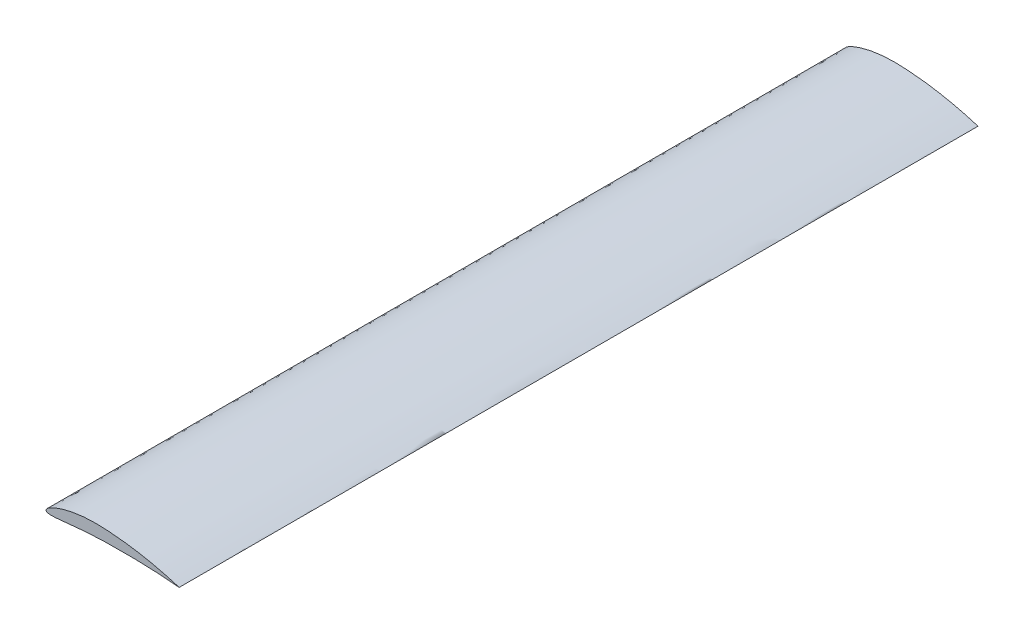
ISO-10303-21;
HEADER;
FILE_DESCRIPTION(('STEP AP214'),'2;1');
FILE_NAME('part.step','',(''),(''),'','','');
FILE_SCHEMA(('AUTOMOTIVE_DESIGN { 1 0 10303 214 1 1 1 1 }'));
ENDSEC;
DATA;
#1=APPLICATION_CONTEXT('core data for automotive mechanical design processes');
#2=APPLICATION_PROTOCOL_DEFINITION('international standard','automotive_design',2000,#1);
#3=PRODUCT_CONTEXT('',#1,'mechanical');
#4=PRODUCT('Part','Part','',(#3));
#5=PRODUCT_RELATED_PRODUCT_CATEGORY('part','',(#4));
#6=PRODUCT_DEFINITION_FORMATION('','',#4);
#7=PRODUCT_DEFINITION_CONTEXT('part definition',#1,'design');
#8=PRODUCT_DEFINITION('design','',#6,#7);
#9=PRODUCT_DEFINITION_SHAPE('','',#8);
#10=(LENGTH_UNIT() NAMED_UNIT(*) SI_UNIT(.MILLI.,.METRE.));
#11=(NAMED_UNIT(*) PLANE_ANGLE_UNIT() SI_UNIT($,.RADIAN.));
#12=(NAMED_UNIT(*) SI_UNIT($,.STERADIAN.) SOLID_ANGLE_UNIT());
#13=UNCERTAINTY_MEASURE_WITH_UNIT(LENGTH_MEASURE(1.E-05),#10,'distance_accuracy_value','');
#14=(GEOMETRIC_REPRESENTATION_CONTEXT(3) GLOBAL_UNCERTAINTY_ASSIGNED_CONTEXT((#13)) GLOBAL_UNIT_ASSIGNED_CONTEXT((#10,
#11,#12)) REPRESENTATION_CONTEXT('',''));
#15=CARTESIAN_POINT('',(0.,0.,0.));
#16=DIRECTION('',(0.,0.,1.));
#17=DIRECTION('',(1.,0.,0.));
#18=AXIS2_PLACEMENT_3D('',#15,#16,#17);
#19=CARTESIAN_POINT('',(304.8,0.,1371.6));
#20=CARTESIAN_POINT('',(304.805073835061,0.0223452680578498,1371.6));
#21=CARTESIAN_POINT('',(303.481699081625,0.379318260828661,1371.6));
#22=CARTESIAN_POINT('',(302.145524330643,0.848466215095664,1371.6));
#23=CARTESIAN_POINT('',(298.844611234037,1.82353660719256,1371.6));
#24=CARTESIAN_POINT('',(294.771260672626,3.04463063019122,1371.6));
#25=CARTESIAN_POINT('',(289.403610922227,4.57967871530911,1371.6));
#26=CARTESIAN_POINT('',(283.019296887063,6.33075892914484,1371.6));
#27=CARTESIAN_POINT('',(275.600696272141,8.26043412946769,1371.6));
#28=CARTESIAN_POINT('',(267.246213076995,10.2929637206997,1371.6));
#29=CARTESIAN_POINT('',(258.039148324702,12.3760065147052,1371.6));
#30=CARTESIAN_POINT('',(248.071437392036,14.4370903830013,1371.6));
#31=CARTESIAN_POINT('',(237.45168025058,16.4188948561654,1371.6));
#32=CARTESIAN_POINT('',(226.29155793466,18.2607483252873,1371.6));
#33=CARTESIAN_POINT('',(214.711374976223,19.9087064187818,1371.6));
#34=CARTESIAN_POINT('',(202.838786210941,21.3175430292081,1371.6));
#35=CARTESIAN_POINT('',(190.806137406406,22.447996452999,1371.6));
#36=CARTESIAN_POINT('',(178.744937721421,23.2536532538869,1371.6));
#37=CARTESIAN_POINT('',(166.728787829646,23.7666812850697,1371.6));
#38=CARTESIAN_POINT('',(154.88525678694,23.7721299883427,1371.6));
#39=CARTESIAN_POINT('',(143.373669303429,23.1646715123743,1371.6));
#40=CARTESIAN_POINT('',(132.403352581969,22.0281827193296,1371.6));
#41=CARTESIAN_POINT('',(122.115548216266,20.4174876809883,1371.6));
#42=CARTESIAN_POINT('',(112.640063500293,18.4155341329611,1371.6));
#43=CARTESIAN_POINT('',(104.089600042979,16.1258261042971,1371.6));
#44=CARTESIAN_POINT('',(96.5664559961237,13.6478084155019,1371.6));
#45=CARTESIAN_POINT('',(90.1476962254819,11.1033503594104,1371.6));
#46=CARTESIAN_POINT('',(84.9047787965066,8.57702912419902,1371.6));
#47=CARTESIAN_POINT('',(80.8540309618645,6.19737021686916,1371.6));
#48=CARTESIAN_POINT('',(78.0465533665293,3.98266451747633,1371.6));
#49=CARTESIAN_POINT('',(76.3296194192058,2.03855857428529,1371.6));
#50=CARTESIAN_POINT('',(75.9249809803407,-0.0800442824522794,1371.6));
#51=CARTESIAN_POINT('',(77.4139039831405,-1.63139365007727,1371.6));
#52=CARTESIAN_POINT('',(79.8773468535195,-2.33384084806238,1371.6));
#53=CARTESIAN_POINT('',(83.355375502213,-2.74428338329707,1371.6));
#54=CARTESIAN_POINT('',(87.9167437676675,-2.76351008534628,1371.6));
#55=CARTESIAN_POINT('',(93.5157873982498,-2.48212130368435,1371.6));
#56=CARTESIAN_POINT('',(100.096306859504,-1.92054378272974,1371.6));
#57=CARTESIAN_POINT('',(107.582782406244,-1.15214222125715,1371.6));
#58=CARTESIAN_POINT('',(115.898989590437,-0.243411782167234,1371.6));
#59=CARTESIAN_POINT('',(124.956384486197,0.737053209643648,1371.6));
#60=CARTESIAN_POINT('',(134.673091917614,1.70813372458074,1371.6));
#61=CARTESIAN_POINT('',(144.955523614402,2.58495096040492,1371.6));
#62=CARTESIAN_POINT('',(155.715305743031,3.30909362914475,1371.6));
#63=CARTESIAN_POINT('',(166.91650921692,3.78883218259216,1371.6));
#64=CARTESIAN_POINT('',(178.454355982485,4.05772292537427,1371.6));
#65=CARTESIAN_POINT('',(190.205787255072,4.29699762821281,1371.6));
#66=CARTESIAN_POINT('',(201.986839641927,4.41851665123374,1371.6));
#67=CARTESIAN_POINT('',(213.665061962112,4.430864608468,1371.6));
#68=CARTESIAN_POINT('',(225.1147703885,4.31962562476159,1371.6));
#69=CARTESIAN_POINT('',(236.210849268118,4.09303246129216,1371.6));
#70=CARTESIAN_POINT('',(246.831288505364,3.7600368654831,1371.6));
#71=CARTESIAN_POINT('',(256.857808237716,3.3439098711033,1371.6));
#72=CARTESIAN_POINT('',(266.176761031174,2.86467190676008,1371.6));
#73=CARTESIAN_POINT('',(274.677370215537,2.35548326445463,1371.6));
#74=CARTESIAN_POINT('',(282.269488448442,1.83875501304582,1371.6));
#75=CARTESIAN_POINT('',(288.833821998197,1.35250350683508,1371.6));
#76=CARTESIAN_POINT('',(294.376832898367,0.905545818584938,1371.6));
#77=CARTESIAN_POINT('',(298.602495472749,0.556825304945098,1371.6));
#78=CARTESIAN_POINT('',(302.023292656171,0.232680411945481,1371.6));
#79=CARTESIAN_POINT('',(303.438256175386,0.154943914454373,1371.6));
#80=CARTESIAN_POINT('',(304.794957490684,-0.0222073088674643,1371.6));
#81=CARTESIAN_POINT('',(304.8,0.,1371.6));
#82=B_SPLINE_CURVE_WITH_KNOTS('',3,(#19,#20,#21,#22,#23,#24,#25,#26,#27,#28,#29,#30,#31,#32,#33,
#34,#35,#36,#37,#38,#39,#40,#41,#42,#43,#44,#45,#46,#47,#48,#49,#50,#51,#52,#53,#54,#55,#56,#57,
#58,#59,#60,#61,#62,#63,#64,#65,#66,#67,#68,#69,#70,#71,#72,#73,#74,#75,#76,#77,#78,#79,#80,
#81),.UNSPECIFIED.,.T.,.F.,(4,1,1,1,1,1,1,1,1,1,1,1,1,1,1,1,1,1,1,1,1,1,1,1,1,1,1,1,1,1,1,1,1,1,
1,1,1,1,1,1,1,1,1,1,1,1,1,1,1,1,1,1,1,1,1,1,1,1,1,1,4),(0.,0.00137455348322331,
0.00548449728179396,0.0122733609908927,0.021682195504866,0.0335806119079948,0.0478307427867091,
0.0643059527211734,0.082777332043007,0.103063756455997,0.124929016786915,0.148149110667858,
0.172444694611559,0.197572105868171,0.223268880537162,0.249227774933554,0.275186209349679,
0.300900708934774,0.326462938278696,0.351222485186767,0.374905858971967,0.397269706218861,
0.418072413969665,0.437079533175026,0.454093093767394,0.468919631578705,0.48139171235289,
0.491447126518173,0.499023571234557,0.504293734329401,0.507921918342,0.511539686153778,
0.516780527527172,0.524216490268905,0.533991629403711,0.546033957270731,0.560220284382465,
0.576403357410148,0.594370816485922,0.613951103581465,0.634916884969972,0.657088503485648,
0.680229909573905,0.704175481107386,0.72909036740664,0.754353775526935,0.779667752347888,
0.804760119952374,0.829359338708984,0.853208710008459,0.876041363199166,0.897604065496152,
0.917662212410958,0.935969860405553,0.952309787739252,0.966502759006892,0.978350082728452,
0.987731492337842,0.994510920242662,0.998633932979557,1.),.UNSPECIFIED.);
#83=DIRECTION('',(0.,0.,-1.));
#84=VECTOR('',#83,1.);
#85=SURFACE_OF_LINEAR_EXTRUSION('',#82,#84);
#86=CARTESIAN_POINT('',(304.8,0.,1371.6));
#87=VERTEX_POINT('',#86);
#88=EDGE_CURVE('E10',#87,#87,#82,.T.);
#89=ORIENTED_EDGE('',*,*,#88,.F.);
#90=EDGE_LOOP('',(#89));
#91=FACE_BOUND('',#90,.T.);
#92=CARTESIAN_POINT('',(304.8,0.,0.));
#93=CARTESIAN_POINT('',(304.805073835061,0.0223452680578498,0.));
#94=CARTESIAN_POINT('',(303.481699081625,0.379318260828661,0.));
#95=CARTESIAN_POINT('',(302.145524330643,0.848466215095664,0.));
#96=CARTESIAN_POINT('',(298.844611234037,1.82353660719256,0.));
#97=CARTESIAN_POINT('',(294.771260672626,3.04463063019122,0.));
#98=CARTESIAN_POINT('',(289.403610922227,4.57967871530911,0.));
#99=CARTESIAN_POINT('',(283.019296887063,6.33075892914484,0.));
#100=CARTESIAN_POINT('',(275.600696272141,8.26043412946769,0.));
#101=CARTESIAN_POINT('',(267.246213076995,10.2929637206997,0.));
#102=CARTESIAN_POINT('',(258.039148324702,12.3760065147052,0.));
#103=CARTESIAN_POINT('',(248.071437392036,14.4370903830013,0.));
#104=CARTESIAN_POINT('',(237.45168025058,16.4188948561654,0.));
#105=CARTESIAN_POINT('',(226.29155793466,18.2607483252873,0.));
#106=CARTESIAN_POINT('',(214.711374976223,19.9087064187818,0.));
#107=CARTESIAN_POINT('',(202.838786210941,21.3175430292081,0.));
#108=CARTESIAN_POINT('',(190.806137406406,22.447996452999,0.));
#109=CARTESIAN_POINT('',(178.744937721421,23.2536532538869,0.));
#110=CARTESIAN_POINT('',(166.728787829646,23.7666812850697,0.));
#111=CARTESIAN_POINT('',(154.88525678694,23.7721299883427,0.));
#112=CARTESIAN_POINT('',(143.373669303429,23.1646715123743,0.));
#113=CARTESIAN_POINT('',(132.403352581969,22.0281827193296,0.));
#114=CARTESIAN_POINT('',(122.115548216266,20.4174876809883,0.));
#115=CARTESIAN_POINT('',(112.640063500293,18.4155341329611,0.));
#116=CARTESIAN_POINT('',(104.089600042979,16.1258261042971,0.));
#117=CARTESIAN_POINT('',(96.5664559961237,13.6478084155019,0.));
#118=CARTESIAN_POINT('',(90.1476962254819,11.1033503594104,0.));
#119=CARTESIAN_POINT('',(84.9047787965066,8.57702912419902,0.));
#120=CARTESIAN_POINT('',(80.8540309618645,6.19737021686916,0.));
#121=CARTESIAN_POINT('',(78.0465533665293,3.98266451747633,0.));
#122=CARTESIAN_POINT('',(76.3296194192058,2.03855857428529,0.));
#123=CARTESIAN_POINT('',(75.9249809803407,-0.0800442824522794,0.));
#124=CARTESIAN_POINT('',(77.4139039831405,-1.63139365007727,0.));
#125=CARTESIAN_POINT('',(79.8773468535195,-2.33384084806238,0.));
#126=CARTESIAN_POINT('',(83.355375502213,-2.74428338329707,0.));
#127=CARTESIAN_POINT('',(87.9167437676675,-2.76351008534628,0.));
#128=CARTESIAN_POINT('',(93.5157873982498,-2.48212130368435,0.));
#129=CARTESIAN_POINT('',(100.096306859504,-1.92054378272974,0.));
#130=CARTESIAN_POINT('',(107.582782406244,-1.15214222125715,0.));
#131=CARTESIAN_POINT('',(115.898989590437,-0.243411782167234,0.));
#132=CARTESIAN_POINT('',(124.956384486197,0.737053209643648,0.));
#133=CARTESIAN_POINT('',(134.673091917614,1.70813372458074,0.));
#134=CARTESIAN_POINT('',(144.955523614402,2.58495096040492,0.));
#135=CARTESIAN_POINT('',(155.715305743031,3.30909362914475,0.));
#136=CARTESIAN_POINT('',(166.91650921692,3.78883218259216,0.));
#137=CARTESIAN_POINT('',(178.454355982485,4.05772292537427,0.));
#138=CARTESIAN_POINT('',(190.205787255072,4.29699762821281,0.));
#139=CARTESIAN_POINT('',(201.986839641927,4.41851665123374,0.));
#140=CARTESIAN_POINT('',(213.665061962112,4.430864608468,0.));
#141=CARTESIAN_POINT('',(225.1147703885,4.31962562476159,0.));
#142=CARTESIAN_POINT('',(236.210849268118,4.09303246129216,0.));
#143=CARTESIAN_POINT('',(246.831288505364,3.7600368654831,0.));
#144=CARTESIAN_POINT('',(256.857808237716,3.3439098711033,0.));
#145=CARTESIAN_POINT('',(266.176761031174,2.86467190676008,0.));
#146=CARTESIAN_POINT('',(274.677370215537,2.35548326445463,0.));
#147=CARTESIAN_POINT('',(282.269488448442,1.83875501304582,0.));
#148=CARTESIAN_POINT('',(288.833821998197,1.35250350683508,0.));
#149=CARTESIAN_POINT('',(294.376832898367,0.905545818584938,0.));
#150=CARTESIAN_POINT('',(298.602495472749,0.556825304945098,0.));
#151=CARTESIAN_POINT('',(302.023292656171,0.232680411945481,0.));
#152=CARTESIAN_POINT('',(303.438256175386,0.154943914454373,0.));
#153=CARTESIAN_POINT('',(304.794957490684,-0.0222073088674643,0.));
#154=CARTESIAN_POINT('',(304.8,0.,0.));
#155=B_SPLINE_CURVE_WITH_KNOTS('',3,(#92,#93,#94,#95,#96,#97,#98,#99,#100,#101,#102,#103,#104,
#105,#106,#107,#108,#109,#110,#111,#112,#113,#114,#115,#116,#117,#118,#119,#120,#121,#122,#123,
#124,#125,#126,#127,#128,#129,#130,#131,#132,#133,#134,#135,#136,#137,#138,#139,#140,#141,#142,
#143,#144,#145,#146,#147,#148,#149,#150,#151,#152,#153,#154),.UNSPECIFIED.,.T.,.F.,(4,1,1,1,1,1,
1,1,1,1,1,1,1,1,1,1,1,1,1,1,1,1,1,1,1,1,1,1,1,1,1,1,1,1,1,1,1,1,1,1,1,1,1,1,1,1,1,1,1,1,1,1,1,1,
1,1,1,1,1,1,4),(0.,0.00137455348322331,0.00548449728179396,0.0122733609908927,0.021682195504866,
0.0335806119079948,0.0478307427867091,0.0643059527211734,0.082777332043007,0.103063756455997,
0.124929016786915,0.148149110667858,0.172444694611559,0.197572105868171,0.223268880537162,
0.249227774933554,0.275186209349679,0.300900708934774,0.326462938278696,0.351222485186767,
0.374905858971967,0.397269706218861,0.418072413969665,0.437079533175026,0.454093093767394,
0.468919631578705,0.48139171235289,0.491447126518173,0.499023571234557,0.504293734329401,
0.507921918342,0.511539686153778,0.516780527527172,0.524216490268905,0.533991629403711,
0.546033957270731,0.560220284382465,0.576403357410148,0.594370816485922,0.613951103581465,
0.634916884969972,0.657088503485648,0.680229909573905,0.704175481107386,0.72909036740664,
0.754353775526935,0.779667752347888,0.804760119952374,0.829359338708984,0.853208710008459,
0.876041363199166,0.897604065496152,0.917662212410958,0.935969860405553,0.952309787739252,
0.966502759006892,0.978350082728452,0.987731492337842,0.994510920242662,0.998633932979557,1.),.UNSPECIFIED.);
#156=CARTESIAN_POINT('',(304.8,0.,0.));
#157=VERTEX_POINT('',#156);
#158=EDGE_CURVE('E34',#157,#157,#155,.T.);
#159=ORIENTED_EDGE('',*,*,#158,.T.);
#160=EDGE_LOOP('',(#159));
#161=FACE_BOUND('',#160,.T.);
#162=ADVANCED_FACE('F30',(#91,#161),#85,.F.);
#163=CARTESIAN_POINT('',(77.5238305450115,3.33891842036834,1371.6));
#164=DIRECTION('',(0.,0.,-1.));
#165=DIRECTION('',(-1.,0.,0.));
#166=AXIS2_PLACEMENT_3D('',#163,#164,#165);
#167=PLANE('',#166);
#168=ORIENTED_EDGE('',*,*,#88,.T.);
#169=EDGE_LOOP('',(#168));
#170=FACE_BOUND('',#169,.T.);
#171=ADVANCED_FACE('F53',(#170),#167,.F.);
#172=CARTESIAN_POINT('',(77.5238305450115,3.33891842036834,0.));
#173=DIRECTION('',(0.,0.,-1.));
#174=DIRECTION('',(-1.,0.,0.));
#175=AXIS2_PLACEMENT_3D('',#172,#173,#174);
#176=PLANE('',#175);
#177=ORIENTED_EDGE('',*,*,#158,.F.);
#178=EDGE_LOOP('',(#177));
#179=FACE_BOUND('',#178,.T.);
#180=ADVANCED_FACE('F51',(#179),#176,.T.);
#181=CLOSED_SHELL('',(#162,#171,#180));
#182=MANIFOLD_SOLID_BREP('B2',#181);
#183=ADVANCED_BREP_SHAPE_REPRESENTATION('',(#18,#182),#14);
#184=SHAPE_DEFINITION_REPRESENTATION(#9,#183);
ENDSEC;
END-ISO-10303-21;
